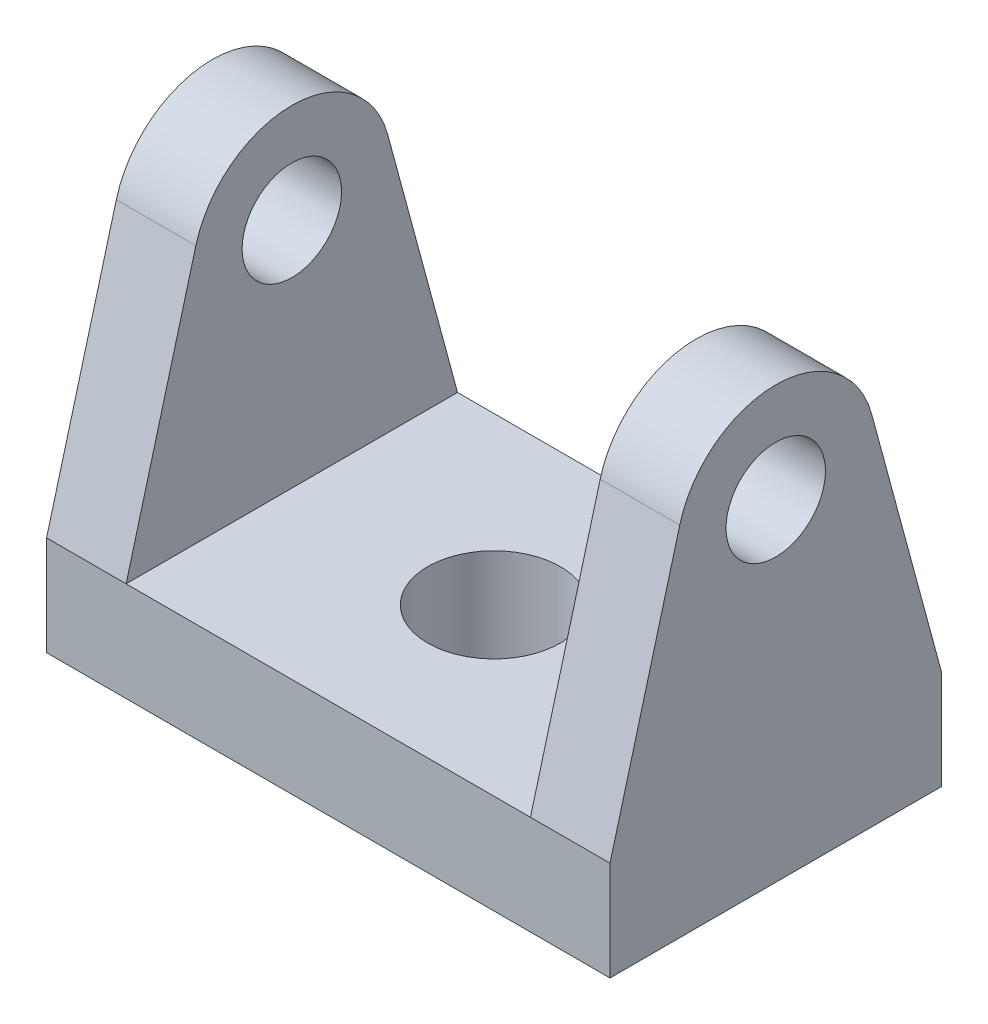
ISO-10303-21;
HEADER;
FILE_DESCRIPTION(('STEP AP214'),'2;1');
FILE_NAME('part.step','',(''),(''),'','','');
FILE_SCHEMA(('AUTOMOTIVE_DESIGN { 1 0 10303 214 1 1 1 1 }'));
ENDSEC;
DATA;
#1=APPLICATION_CONTEXT('core data for automotive mechanical design processes');
#2=APPLICATION_PROTOCOL_DEFINITION('international standard','automotive_design',2000,#1);
#3=PRODUCT_CONTEXT('',#1,'mechanical');
#4=PRODUCT('Part','Part','',(#3));
#5=PRODUCT_RELATED_PRODUCT_CATEGORY('part','',(#4));
#6=PRODUCT_DEFINITION_FORMATION('','',#4);
#7=PRODUCT_DEFINITION_CONTEXT('part definition',#1,'design');
#8=PRODUCT_DEFINITION('design','',#6,#7);
#9=PRODUCT_DEFINITION_SHAPE('','',#8);
#10=(LENGTH_UNIT() NAMED_UNIT(*) SI_UNIT(.MILLI.,.METRE.));
#11=(NAMED_UNIT(*) PLANE_ANGLE_UNIT() SI_UNIT($,.RADIAN.));
#12=(NAMED_UNIT(*) SI_UNIT($,.STERADIAN.) SOLID_ANGLE_UNIT());
#13=UNCERTAINTY_MEASURE_WITH_UNIT(LENGTH_MEASURE(1.E-05),#10,'distance_accuracy_value','');
#14=(GEOMETRIC_REPRESENTATION_CONTEXT(3) GLOBAL_UNCERTAINTY_ASSIGNED_CONTEXT((#13)) GLOBAL_UNIT_ASSIGNED_CONTEXT((#10,
#11,#12)) REPRESENTATION_CONTEXT('',''));
#15=CARTESIAN_POINT('',(0.,0.,0.));
#16=DIRECTION('',(0.,0.,1.));
#17=DIRECTION('',(1.,0.,0.));
#18=AXIS2_PLACEMENT_3D('',#15,#16,#17);
#19=CARTESIAN_POINT('',(0.,15.,0.));
#20=DIRECTION('',(0.,-1.,0.));
#21=DIRECTION('',(0.,0.,-1.));
#22=AXIS2_PLACEMENT_3D('',#19,#20,#21);
#23=PLANE('',#22);
#24=CARTESIAN_POINT('',(0.,15.,0.));
#25=DIRECTION('',(0.,1.,0.));
#26=DIRECTION('',(0.,0.,1.));
#27=AXIS2_PLACEMENT_3D('',#24,#25,#26);
#28=CIRCLE('',#27,10.);
#29=CARTESIAN_POINT('',(0.,15.,10.));
#30=VERTEX_POINT('',#29);
#31=EDGE_CURVE('E192',#30,#30,#28,.T.);
#32=ORIENTED_EDGE('',*,*,#31,.F.);
#33=EDGE_LOOP('',(#32));
#34=FACE_BOUND('',#33,.T.);
#35=DIRECTION('',(0.,0.,1.));
#36=VECTOR('',#35,1.);
#37=CARTESIAN_POINT('',(30.5,15.,-25.));
#38=LINE('',#37,#36);
#39=CARTESIAN_POINT('',(30.5,15.,-25.));
#40=VERTEX_POINT('',#39);
#41=CARTESIAN_POINT('',(30.5,15.,25.));
#42=VERTEX_POINT('',#41);
#43=EDGE_CURVE('E140',#40,#42,#38,.T.);
#44=ORIENTED_EDGE('',*,*,#43,.F.);
#45=DIRECTION('',(-1.,0.,0.));
#46=VECTOR('',#45,1.);
#47=CARTESIAN_POINT('',(42.5,15.,-25.));
#48=LINE('',#47,#46);
#49=CARTESIAN_POINT('',(-30.5,15.,-25.));
#50=VERTEX_POINT('',#49);
#51=EDGE_CURVE('E200',#40,#50,#48,.T.);
#52=ORIENTED_EDGE('',*,*,#51,.T.);
#53=DIRECTION('',(0.,0.,1.));
#54=VECTOR('',#53,1.);
#55=CARTESIAN_POINT('',(-30.5,15.,-25.));
#56=LINE('',#55,#54);
#57=CARTESIAN_POINT('',(-30.5,15.,25.));
#58=VERTEX_POINT('',#57);
#59=EDGE_CURVE('E170',#50,#58,#56,.T.);
#60=ORIENTED_EDGE('',*,*,#59,.T.);
#61=DIRECTION('',(1.,0.,0.));
#62=VECTOR('',#61,1.);
#63=CARTESIAN_POINT('',(42.5,15.,25.));
#64=LINE('',#63,#62);
#65=EDGE_CURVE('E201',#58,#42,#64,.T.);
#66=ORIENTED_EDGE('',*,*,#65,.T.);
#67=EDGE_LOOP('',(#44,#52,#60,#66));
#68=FACE_BOUND('',#67,.T.);
#69=ADVANCED_FACE('F37',(#34,#68),#23,.F.);
#70=CARTESIAN_POINT('',(0.,0.,0.));
#71=DIRECTION('',(0.,-1.,0.));
#72=DIRECTION('',(0.,0.,-1.));
#73=AXIS2_PLACEMENT_3D('',#70,#71,#72);
#74=PLANE('',#73);
#75=DIRECTION('',(0.,0.,1.));
#76=VECTOR('',#75,1.);
#77=CARTESIAN_POINT('',(-42.5,0.,-25.));
#78=LINE('',#77,#76);
#79=CARTESIAN_POINT('',(-42.5,0.,-25.));
#80=VERTEX_POINT('',#79);
#81=CARTESIAN_POINT('',(-42.5,0.,25.));
#82=VERTEX_POINT('',#81);
#83=EDGE_CURVE('E195',#80,#82,#78,.T.);
#84=ORIENTED_EDGE('',*,*,#83,.F.);
#85=DIRECTION('',(-1.,0.,0.));
#86=VECTOR('',#85,1.);
#87=CARTESIAN_POINT('',(42.5,0.,-25.));
#88=LINE('',#87,#86);
#89=CARTESIAN_POINT('',(42.5,0.,-25.));
#90=VERTEX_POINT('',#89);
#91=EDGE_CURVE('E210',#90,#80,#88,.T.);
#92=ORIENTED_EDGE('',*,*,#91,.F.);
#93=DIRECTION('',(0.,0.,-1.));
#94=VECTOR('',#93,1.);
#95=CARTESIAN_POINT('',(42.5,0.,-25.));
#96=LINE('',#95,#94);
#97=CARTESIAN_POINT('',(42.5,0.,25.));
#98=VERTEX_POINT('',#97);
#99=EDGE_CURVE('E208',#98,#90,#96,.T.);
#100=ORIENTED_EDGE('',*,*,#99,.F.);
#101=DIRECTION('',(1.,0.,0.));
#102=VECTOR('',#101,1.);
#103=CARTESIAN_POINT('',(42.5,0.,25.));
#104=LINE('',#103,#102);
#105=EDGE_CURVE('E206',#82,#98,#104,.T.);
#106=ORIENTED_EDGE('',*,*,#105,.F.);
#107=EDGE_LOOP('',(#84,#92,#100,#106));
#108=FACE_BOUND('',#107,.T.);
#109=CARTESIAN_POINT('',(0.,0.,0.));
#110=DIRECTION('',(0.,1.,0.));
#111=DIRECTION('',(0.,0.,1.));
#112=AXIS2_PLACEMENT_3D('',#109,#110,#111);
#113=CIRCLE('',#112,10.);
#114=CARTESIAN_POINT('',(0.,0.,10.));
#115=VERTEX_POINT('',#114);
#116=EDGE_CURVE('E188',#115,#115,#113,.T.);
#117=ORIENTED_EDGE('',*,*,#116,.T.);
#118=EDGE_LOOP('',(#117));
#119=FACE_BOUND('',#118,.T.);
#120=ADVANCED_FACE('F225',(#108,#119),#74,.T.);
#121=CARTESIAN_POINT('',(-42.5,15.,-25.));
#122=DIRECTION('',(1.,0.,0.));
#123=DIRECTION('',(0.,0.,-1.));
#124=AXIS2_PLACEMENT_3D('',#121,#122,#123);
#125=PLANE('',#124);
#126=ORIENTED_EDGE('',*,*,#83,.T.);
#127=DIRECTION('',(0.,-1.,0.));
#128=VECTOR('',#127,1.);
#129=CARTESIAN_POINT('',(-42.5,15.,25.));
#130=LINE('',#129,#128);
#131=CARTESIAN_POINT('',(-42.5,15.,25.));
#132=VERTEX_POINT('',#131);
#133=EDGE_CURVE('E11',#132,#82,#130,.T.);
#134=ORIENTED_EDGE('',*,*,#133,.F.);
#135=DIRECTION('',(0.,0.965348705920133,-0.260963361371524));
#136=VECTOR('',#135,1.);
#137=CARTESIAN_POINT('',(-42.5,15.,25.));
#138=LINE('',#137,#136);
#139=CARTESIAN_POINT('',(-42.5,53.9144504205729,14.480230588802));
#140=VERTEX_POINT('',#139);
#141=EDGE_CURVE('E181',#132,#140,#138,.T.);
#142=ORIENTED_EDGE('',*,*,#141,.T.);
#143=CARTESIAN_POINT('',(-42.5,50.,0.));
#144=DIRECTION('',(-1.,0.,0.));
#145=DIRECTION('',(0.,0.,1.));
#146=AXIS2_PLACEMENT_3D('',#143,#144,#145);
#147=CIRCLE('',#146,15.);
#148=CARTESIAN_POINT('',(-42.5,53.9144504205729,-14.480230588802));
#149=VERTEX_POINT('',#148);
#150=EDGE_CURVE('E171',#140,#149,#147,.T.);
#151=ORIENTED_EDGE('',*,*,#150,.T.);
#152=DIRECTION('',(0.,-0.965348705920133,-0.260963361371524));
#153=VECTOR('',#152,1.);
#154=CARTESIAN_POINT('',(-42.5,15.,-25.));
#155=LINE('',#154,#153);
#156=CARTESIAN_POINT('',(-42.5,15.,-25.));
#157=VERTEX_POINT('',#156);
#158=EDGE_CURVE('E164',#149,#157,#155,.T.);
#159=ORIENTED_EDGE('',*,*,#158,.T.);
#160=DIRECTION('',(0.,-1.,0.));
#161=VECTOR('',#160,1.);
#162=CARTESIAN_POINT('',(-42.5,15.,-25.));
#163=LINE('',#162,#161);
#164=EDGE_CURVE('E203',#157,#80,#163,.T.);
#165=ORIENTED_EDGE('',*,*,#164,.T.);
#166=EDGE_LOOP('',(#126,#134,#142,#151,#159,#165));
#167=FACE_BOUND('',#166,.T.);
#168=CARTESIAN_POINT('',(-42.5,50.,0.));
#169=DIRECTION('',(-1.,0.,0.));
#170=DIRECTION('',(0.,0.,1.));
#171=AXIS2_PLACEMENT_3D('',#168,#169,#170);
#172=CIRCLE('',#171,7.5);
#173=CARTESIAN_POINT('',(-42.5,50.,7.50000000000001));
#174=VERTEX_POINT('',#173);
#175=EDGE_CURVE('E159',#174,#174,#172,.T.);
#176=ORIENTED_EDGE('',*,*,#175,.F.);
#177=EDGE_LOOP('',(#176));
#178=FACE_BOUND('',#177,.T.);
#179=ADVANCED_FACE('F39',(#167,#178),#125,.F.);
#180=CARTESIAN_POINT('',(42.5,15.,25.));
#181=DIRECTION('',(0.,0.,-1.));
#182=DIRECTION('',(-1.,0.,0.));
#183=AXIS2_PLACEMENT_3D('',#180,#181,#182);
#184=PLANE('',#183);
#185=ORIENTED_EDGE('',*,*,#105,.T.);
#186=DIRECTION('',(0.,-1.,0.));
#187=VECTOR('',#186,1.);
#188=CARTESIAN_POINT('',(42.5,15.,25.));
#189=LINE('',#188,#187);
#190=CARTESIAN_POINT('',(42.5,15.,25.));
#191=VERTEX_POINT('',#190);
#192=EDGE_CURVE('E45',#191,#98,#189,.T.);
#193=ORIENTED_EDGE('',*,*,#192,.F.);
#194=DIRECTION('',(1.,0.,0.));
#195=VECTOR('',#194,1.);
#196=CARTESIAN_POINT('',(30.5,15.,25.));
#197=LINE('',#196,#195);
#198=EDGE_CURVE('E52',#42,#191,#197,.T.);
#199=ORIENTED_EDGE('',*,*,#198,.F.);
#200=ORIENTED_EDGE('',*,*,#65,.F.);
#201=EDGE_CURVE('E198',#132,#58,#64,.T.);
#202=ORIENTED_EDGE('',*,*,#201,.F.);
#203=ORIENTED_EDGE('',*,*,#133,.T.);
#204=EDGE_LOOP('',(#185,#193,#199,#200,#202,#203));
#205=FACE_BOUND('',#204,.T.);
#206=ADVANCED_FACE('F268',(#205),#184,.F.);
#207=CARTESIAN_POINT('',(42.5,15.,-25.));
#208=DIRECTION('',(-1.,0.,0.));
#209=DIRECTION('',(0.,0.,1.));
#210=AXIS2_PLACEMENT_3D('',#207,#208,#209);
#211=PLANE('',#210);
#212=ORIENTED_EDGE('',*,*,#99,.T.);
#213=DIRECTION('',(0.,-1.,0.));
#214=VECTOR('',#213,1.);
#215=CARTESIAN_POINT('',(42.5,15.,-25.));
#216=LINE('',#215,#214);
#217=CARTESIAN_POINT('',(42.5,15.,-25.));
#218=VERTEX_POINT('',#217);
#219=EDGE_CURVE('E214',#218,#90,#216,.T.);
#220=ORIENTED_EDGE('',*,*,#219,.F.);
#221=DIRECTION('',(0.,-0.965348705920133,-0.260963361371524));
#222=VECTOR('',#221,1.);
#223=CARTESIAN_POINT('',(42.5,15.,-25.));
#224=LINE('',#223,#222);
#225=CARTESIAN_POINT('',(42.5,53.9144504205729,-14.480230588802));
#226=VERTEX_POINT('',#225);
#227=EDGE_CURVE('E154',#226,#218,#224,.T.);
#228=ORIENTED_EDGE('',*,*,#227,.F.);
#229=CARTESIAN_POINT('',(42.5,50.,0.));
#230=DIRECTION('',(-1.,0.,0.));
#231=DIRECTION('',(0.,0.,1.));
#232=AXIS2_PLACEMENT_3D('',#229,#230,#231);
#233=CIRCLE('',#232,15.);
#234=CARTESIAN_POINT('',(42.5,53.9144504205729,14.480230588802));
#235=VERTEX_POINT('',#234);
#236=EDGE_CURVE('E135',#235,#226,#233,.T.);
#237=ORIENTED_EDGE('',*,*,#236,.F.);
#238=DIRECTION('',(0.,0.965348705920133,-0.260963361371524));
#239=VECTOR('',#238,1.);
#240=CARTESIAN_POINT('',(42.5,15.,25.));
#241=LINE('',#240,#239);
#242=EDGE_CURVE('E145',#191,#235,#241,.T.);
#243=ORIENTED_EDGE('',*,*,#242,.F.);
#244=ORIENTED_EDGE('',*,*,#192,.T.);
#245=EDGE_LOOP('',(#212,#220,#228,#237,#243,#244));
#246=FACE_BOUND('',#245,.T.);
#247=CARTESIAN_POINT('',(42.5,50.,0.));
#248=DIRECTION('',(-1.,0.,0.));
#249=DIRECTION('',(0.,0.,1.));
#250=AXIS2_PLACEMENT_3D('',#247,#248,#249);
#251=CIRCLE('',#250,7.5);
#252=CARTESIAN_POINT('',(42.5,50.,7.50000000000001));
#253=VERTEX_POINT('',#252);
#254=EDGE_CURVE('E149',#253,#253,#251,.T.);
#255=ORIENTED_EDGE('',*,*,#254,.T.);
#256=EDGE_LOOP('',(#255));
#257=FACE_BOUND('',#256,.T.);
#258=ADVANCED_FACE('F220',(#246,#257),#211,.F.);
#259=CARTESIAN_POINT('',(42.5,15.,-25.));
#260=DIRECTION('',(0.,0.,1.));
#261=DIRECTION('',(1.,0.,0.));
#262=AXIS2_PLACEMENT_3D('',#259,#260,#261);
#263=PLANE('',#262);
#264=ORIENTED_EDGE('',*,*,#91,.T.);
#265=ORIENTED_EDGE('',*,*,#164,.F.);
#266=DIRECTION('',(-1.,0.,0.));
#267=VECTOR('',#266,1.);
#268=CARTESIAN_POINT('',(-30.5,15.,-25.));
#269=LINE('',#268,#267);
#270=EDGE_CURVE('E178',#50,#157,#269,.T.);
#271=ORIENTED_EDGE('',*,*,#270,.F.);
#272=ORIENTED_EDGE('',*,*,#51,.F.);
#273=EDGE_CURVE('E144',#218,#40,#48,.T.);
#274=ORIENTED_EDGE('',*,*,#273,.F.);
#275=ORIENTED_EDGE('',*,*,#219,.T.);
#276=EDGE_LOOP('',(#264,#265,#271,#272,#274,#275));
#277=FACE_BOUND('',#276,.T.);
#278=ADVANCED_FACE('F229',(#277),#263,.F.);
#279=CARTESIAN_POINT('',(0.,15.,0.));
#280=DIRECTION('',(0.,-1.,0.));
#281=DIRECTION('',(0.,0.,-1.));
#282=AXIS2_PLACEMENT_3D('',#279,#280,#281);
#283=CYLINDRICAL_SURFACE('',#282,10.);
#284=ORIENTED_EDGE('',*,*,#31,.T.);
#285=EDGE_LOOP('',(#284));
#286=FACE_BOUND('',#285,.T.);
#287=ORIENTED_EDGE('',*,*,#116,.F.);
#288=EDGE_LOOP('',(#287));
#289=FACE_BOUND('',#288,.T.);
#290=ADVANCED_FACE('F262',(#286,#289),#283,.F.);
#291=CARTESIAN_POINT('',(-30.5,15.,-25.));
#292=DIRECTION('',(0.,0.260963361371524,-0.965348705920133));
#293=DIRECTION('',(0.,0.965348705920133,0.260963361371524));
#294=AXIS2_PLACEMENT_3D('',#291,#292,#293);
#295=PLANE('',#294);
#296=ORIENTED_EDGE('',*,*,#158,.F.);
#297=DIRECTION('',(-1.,0.,0.));
#298=VECTOR('',#297,1.);
#299=CARTESIAN_POINT('',(-30.5,53.9144504205729,-14.480230588802));
#300=LINE('',#299,#298);
#301=CARTESIAN_POINT('',(-30.5,53.9144504205729,-14.480230588802));
#302=VERTEX_POINT('',#301);
#303=EDGE_CURVE('E186',#302,#149,#300,.T.);
#304=ORIENTED_EDGE('',*,*,#303,.F.);
#305=DIRECTION('',(0.,-0.965348705920133,-0.260963361371524));
#306=VECTOR('',#305,1.);
#307=CARTESIAN_POINT('',(-30.5,15.,-25.));
#308=LINE('',#307,#306);
#309=EDGE_CURVE('E167',#302,#50,#308,.T.);
#310=ORIENTED_EDGE('',*,*,#309,.T.);
#311=ORIENTED_EDGE('',*,*,#270,.T.);
#312=EDGE_LOOP('',(#296,#304,#310,#311));
#313=FACE_BOUND('',#312,.T.);
#314=ADVANCED_FACE('F237',(#313),#295,.T.);
#315=CARTESIAN_POINT('',(-30.5,50.,0.));
#316=DIRECTION('',(-1.,0.,0.));
#317=DIRECTION('',(0.,0.,1.));
#318=AXIS2_PLACEMENT_3D('',#315,#316,#317);
#319=CYLINDRICAL_SURFACE('',#318,15.);
#320=ORIENTED_EDGE('',*,*,#150,.F.);
#321=DIRECTION('',(-1.,0.,0.));
#322=VECTOR('',#321,1.);
#323=CARTESIAN_POINT('',(-30.5,53.9144504205729,14.480230588802));
#324=LINE('',#323,#322);
#325=CARTESIAN_POINT('',(-30.5,53.9144504205729,14.480230588802));
#326=VERTEX_POINT('',#325);
#327=EDGE_CURVE('E189',#326,#140,#324,.T.);
#328=ORIENTED_EDGE('',*,*,#327,.F.);
#329=CARTESIAN_POINT('',(-30.5,50.,0.));
#330=DIRECTION('',(-1.,0.,0.));
#331=DIRECTION('',(0.,0.,1.));
#332=AXIS2_PLACEMENT_3D('',#329,#330,#331);
#333=CIRCLE('',#332,15.);
#334=EDGE_CURVE('E175',#326,#302,#333,.T.);
#335=ORIENTED_EDGE('',*,*,#334,.T.);
#336=ORIENTED_EDGE('',*,*,#303,.T.);
#337=EDGE_LOOP('',(#320,#328,#335,#336));
#338=FACE_BOUND('',#337,.T.);
#339=ADVANCED_FACE('F276',(#338),#319,.T.);
#340=CARTESIAN_POINT('',(-30.5,15.,25.));
#341=DIRECTION('',(0.,0.260963361371524,0.965348705920133));
#342=DIRECTION('',(0.,-0.965348705920133,0.260963361371524));
#343=AXIS2_PLACEMENT_3D('',#340,#341,#342);
#344=PLANE('',#343);
#345=ORIENTED_EDGE('',*,*,#141,.F.);
#346=ORIENTED_EDGE('',*,*,#201,.T.);
#347=DIRECTION('',(0.,0.965348705920133,-0.260963361371524));
#348=VECTOR('',#347,1.);
#349=CARTESIAN_POINT('',(-30.5,15.,25.));
#350=LINE('',#349,#348);
#351=EDGE_CURVE('E60',#58,#326,#350,.T.);
#352=ORIENTED_EDGE('',*,*,#351,.T.);
#353=ORIENTED_EDGE('',*,*,#327,.T.);
#354=EDGE_LOOP('',(#345,#346,#352,#353));
#355=FACE_BOUND('',#354,.T.);
#356=ADVANCED_FACE('F280',(#355),#344,.T.);
#357=CARTESIAN_POINT('',(-30.5,50.,0.));
#358=DIRECTION('',(-1.,0.,0.));
#359=DIRECTION('',(0.,0.,1.));
#360=AXIS2_PLACEMENT_3D('',#357,#358,#359);
#361=PLANE('',#360);
#362=CARTESIAN_POINT('',(-30.5,50.,0.));
#363=DIRECTION('',(-1.,0.,0.));
#364=DIRECTION('',(0.,0.,1.));
#365=AXIS2_PLACEMENT_3D('',#362,#363,#364);
#366=CIRCLE('',#365,7.5);
#367=CARTESIAN_POINT('',(-30.5,50.,7.5));
#368=VERTEX_POINT('',#367);
#369=EDGE_CURVE('E161',#368,#368,#366,.T.);
#370=ORIENTED_EDGE('',*,*,#369,.T.);
#371=EDGE_LOOP('',(#370));
#372=FACE_BOUND('',#371,.T.);
#373=ORIENTED_EDGE('',*,*,#309,.F.);
#374=ORIENTED_EDGE('',*,*,#334,.F.);
#375=ORIENTED_EDGE('',*,*,#351,.F.);
#376=ORIENTED_EDGE('',*,*,#59,.F.);
#377=EDGE_LOOP('',(#373,#374,#375,#376));
#378=FACE_BOUND('',#377,.T.);
#379=ADVANCED_FACE('F277',(#372,#378),#361,.F.);
#380=CARTESIAN_POINT('',(-30.5,50.,0.));
#381=DIRECTION('',(-1.,0.,0.));
#382=DIRECTION('',(0.,0.,1.));
#383=AXIS2_PLACEMENT_3D('',#380,#381,#382);
#384=CYLINDRICAL_SURFACE('',#383,7.5);
#385=ORIENTED_EDGE('',*,*,#369,.F.);
#386=EDGE_LOOP('',(#385));
#387=FACE_BOUND('',#386,.T.);
#388=ORIENTED_EDGE('',*,*,#175,.T.);
#389=EDGE_LOOP('',(#388));
#390=FACE_BOUND('',#389,.T.);
#391=ADVANCED_FACE('F279',(#387,#390),#384,.F.);
#392=CARTESIAN_POINT('',(30.5,50.,0.));
#393=DIRECTION('',(1.,0.,0.));
#394=DIRECTION('',(0.,0.,1.));
#395=AXIS2_PLACEMENT_3D('',#392,#393,#394);
#396=PLANE('',#395);
#397=DIRECTION('',(0.,-0.965348705920133,-0.260963361371524));
#398=VECTOR('',#397,1.);
#399=CARTESIAN_POINT('',(30.5,15.,-25.));
#400=LINE('',#399,#398);
#401=CARTESIAN_POINT('',(30.5,53.9144504205729,-14.480230588802));
#402=VERTEX_POINT('',#401);
#403=EDGE_CURVE('E123',#402,#40,#400,.T.);
#404=ORIENTED_EDGE('',*,*,#403,.T.);
#405=ORIENTED_EDGE('',*,*,#43,.T.);
#406=DIRECTION('',(0.,0.965348705920133,-0.260963361371524));
#407=VECTOR('',#406,1.);
#408=CARTESIAN_POINT('',(30.5,15.,25.));
#409=LINE('',#408,#407);
#410=CARTESIAN_POINT('',(30.5,53.9144504205729,14.480230588802));
#411=VERTEX_POINT('',#410);
#412=EDGE_CURVE('E126',#42,#411,#409,.T.);
#413=ORIENTED_EDGE('',*,*,#412,.T.);
#414=CARTESIAN_POINT('',(30.5,50.,0.));
#415=DIRECTION('',(-1.,0.,0.));
#416=DIRECTION('',(0.,0.,1.));
#417=AXIS2_PLACEMENT_3D('',#414,#415,#416);
#418=CIRCLE('',#417,15.);
#419=EDGE_CURVE('E117',#411,#402,#418,.T.);
#420=ORIENTED_EDGE('',*,*,#419,.T.);
#421=EDGE_LOOP('',(#404,#405,#413,#420));
#422=FACE_BOUND('',#421,.T.);
#423=CARTESIAN_POINT('',(30.5,50.,0.));
#424=DIRECTION('',(-1.,0.,0.));
#425=DIRECTION('',(0.,0.,1.));
#426=AXIS2_PLACEMENT_3D('',#423,#424,#425);
#427=CIRCLE('',#426,7.5);
#428=CARTESIAN_POINT('',(30.5,50.,7.5));
#429=VERTEX_POINT('',#428);
#430=EDGE_CURVE('E156',#429,#429,#427,.T.);
#431=ORIENTED_EDGE('',*,*,#430,.F.);
#432=EDGE_LOOP('',(#431));
#433=FACE_BOUND('',#432,.T.);
#434=ADVANCED_FACE('F119',(#422,#433),#396,.F.);
#435=CARTESIAN_POINT('',(30.5,15.,-25.));
#436=DIRECTION('',(0.,-0.260963361371524,0.965348705920133));
#437=DIRECTION('',(0.,-0.965348705920133,-0.260963361371524));
#438=AXIS2_PLACEMENT_3D('',#435,#436,#437);
#439=PLANE('',#438);
#440=ORIENTED_EDGE('',*,*,#227,.T.);
#441=ORIENTED_EDGE('',*,*,#273,.T.);
#442=ORIENTED_EDGE('',*,*,#403,.F.);
#443=DIRECTION('',(1.,0.,0.));
#444=VECTOR('',#443,1.);
#445=CARTESIAN_POINT('',(30.5,53.9144504205729,-14.480230588802));
#446=LINE('',#445,#444);
#447=EDGE_CURVE('E132',#402,#226,#446,.T.);
#448=ORIENTED_EDGE('',*,*,#447,.T.);
#449=EDGE_LOOP('',(#440,#441,#442,#448));
#450=FACE_BOUND('',#449,.T.);
#451=ADVANCED_FACE('F142',(#450),#439,.F.);
#452=CARTESIAN_POINT('',(30.5,15.,25.));
#453=DIRECTION('',(0.,-0.260963361371524,-0.965348705920133));
#454=DIRECTION('',(0.,0.965348705920133,-0.260963361371524));
#455=AXIS2_PLACEMENT_3D('',#452,#453,#454);
#456=PLANE('',#455);
#457=ORIENTED_EDGE('',*,*,#242,.T.);
#458=DIRECTION('',(1.,0.,0.));
#459=VECTOR('',#458,1.);
#460=CARTESIAN_POINT('',(30.5,53.9144504205729,14.480230588802));
#461=LINE('',#460,#459);
#462=EDGE_CURVE('E139',#411,#235,#461,.T.);
#463=ORIENTED_EDGE('',*,*,#462,.F.);
#464=ORIENTED_EDGE('',*,*,#412,.F.);
#465=ORIENTED_EDGE('',*,*,#198,.T.);
#466=EDGE_LOOP('',(#457,#463,#464,#465));
#467=FACE_BOUND('',#466,.T.);
#468=ADVANCED_FACE('F242',(#467),#456,.F.);
#469=CARTESIAN_POINT('',(30.5,50.,0.));
#470=DIRECTION('',(1.,0.,0.));
#471=DIRECTION('',(0.,0.,-1.));
#472=AXIS2_PLACEMENT_3D('',#469,#470,#471);
#473=CYLINDRICAL_SURFACE('',#472,15.);
#474=ORIENTED_EDGE('',*,*,#236,.T.);
#475=ORIENTED_EDGE('',*,*,#447,.F.);
#476=ORIENTED_EDGE('',*,*,#419,.F.);
#477=ORIENTED_EDGE('',*,*,#462,.T.);
#478=EDGE_LOOP('',(#474,#475,#476,#477));
#479=FACE_BOUND('',#478,.T.);
#480=ADVANCED_FACE('F133',(#479),#473,.T.);
#481=CARTESIAN_POINT('',(30.5,50.,0.));
#482=DIRECTION('',(1.,0.,0.));
#483=DIRECTION('',(0.,0.,-1.));
#484=AXIS2_PLACEMENT_3D('',#481,#482,#483);
#485=CYLINDRICAL_SURFACE('',#484,7.5);
#486=ORIENTED_EDGE('',*,*,#430,.T.);
#487=EDGE_LOOP('',(#486));
#488=FACE_BOUND('',#487,.T.);
#489=ORIENTED_EDGE('',*,*,#254,.F.);
#490=EDGE_LOOP('',(#489));
#491=FACE_BOUND('',#490,.T.);
#492=ADVANCED_FACE('F249',(#488,#491),#485,.F.);
#493=CLOSED_SHELL('',(#69,#120,#179,#206,#258,#278,#290,#314,#339,#356,#379,#391,#434,#451,#468,
#480,#492));
#494=MANIFOLD_SOLID_BREP('B2',#493);
#495=ADVANCED_BREP_SHAPE_REPRESENTATION('',(#18,#494),#14);
#496=SHAPE_DEFINITION_REPRESENTATION(#9,#495);
ENDSEC;
END-ISO-10303-21;
